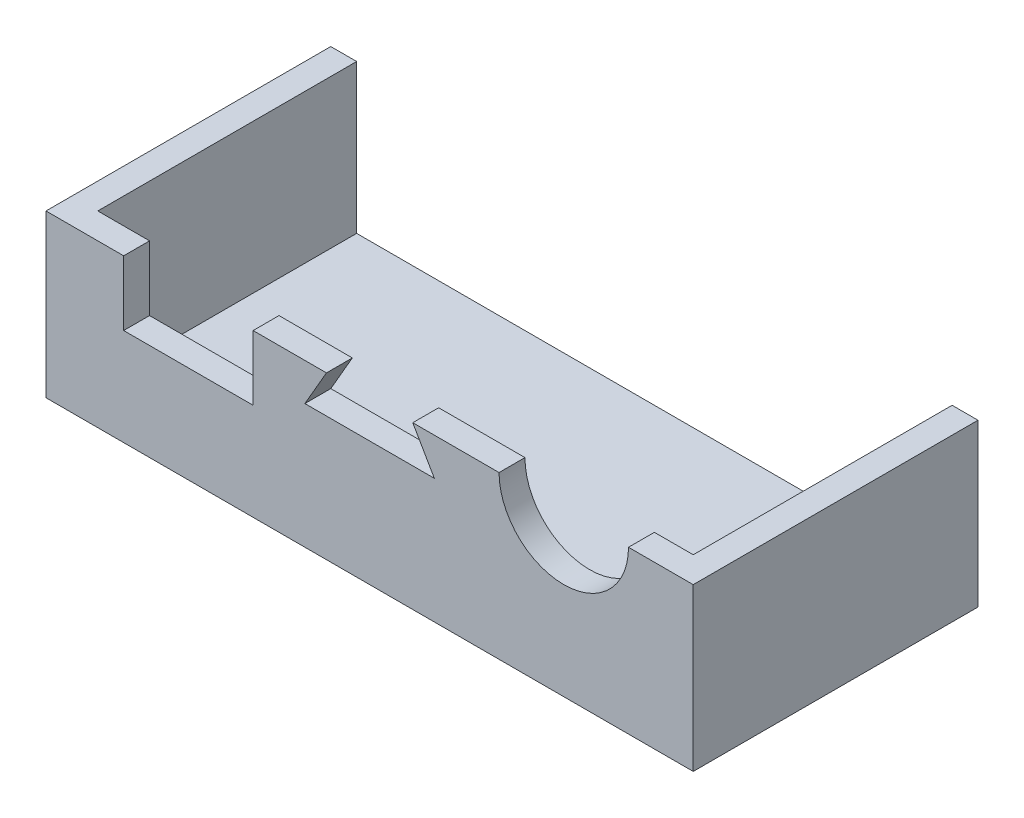
ISO-10303-21;
HEADER;
FILE_DESCRIPTION(('STEP AP214'),'2;1');
FILE_NAME('part.step','',(''),(''),'','','');
FILE_SCHEMA(('AUTOMOTIVE_DESIGN { 1 0 10303 214 1 1 1 1 }'));
ENDSEC;
DATA;
#1=APPLICATION_CONTEXT('core data for automotive mechanical design processes');
#2=APPLICATION_PROTOCOL_DEFINITION('international standard','automotive_design',2000,#1);
#3=PRODUCT_CONTEXT('',#1,'mechanical');
#4=PRODUCT('Part','Part','',(#3));
#5=PRODUCT_RELATED_PRODUCT_CATEGORY('part','',(#4));
#6=PRODUCT_DEFINITION_FORMATION('','',#4);
#7=PRODUCT_DEFINITION_CONTEXT('part definition',#1,'design');
#8=PRODUCT_DEFINITION('design','',#6,#7);
#9=PRODUCT_DEFINITION_SHAPE('','',#8);
#10=(LENGTH_UNIT() NAMED_UNIT(*) SI_UNIT(.MILLI.,.METRE.));
#11=(NAMED_UNIT(*) PLANE_ANGLE_UNIT() SI_UNIT($,.RADIAN.));
#12=(NAMED_UNIT(*) SI_UNIT($,.STERADIAN.) SOLID_ANGLE_UNIT());
#13=UNCERTAINTY_MEASURE_WITH_UNIT(LENGTH_MEASURE(1.E-05),#10,'distance_accuracy_value','');
#14=(GEOMETRIC_REPRESENTATION_CONTEXT(3) GLOBAL_UNCERTAINTY_ASSIGNED_CONTEXT((#13)) GLOBAL_UNIT_ASSIGNED_CONTEXT((#10,
#11,#12)) REPRESENTATION_CONTEXT('',''));
#15=CARTESIAN_POINT('',(0.,0.,0.));
#16=DIRECTION('',(0.,0.,1.));
#17=DIRECTION('',(1.,0.,0.));
#18=AXIS2_PLACEMENT_3D('',#15,#16,#17);
#19=CARTESIAN_POINT('',(-138.233831443166,0.,375.46845739689));
#20=DIRECTION('',(0.,1.,0.));
#21=DIRECTION('',(0.,0.,1.));
#22=AXIS2_PLACEMENT_3D('',#19,#20,#21);
#23=PLANE('',#22);
#24=DIRECTION('',(-1.,0.,0.));
#25=VECTOR('',#24,1.);
#26=CARTESIAN_POINT('',(0.,0.,110.));
#27=LINE('',#26,#25);
#28=CARTESIAN_POINT('',(125.,0.,110.));
#29=VERTEX_POINT('',#28);
#30=CARTESIAN_POINT('',(99.9999999999999,0.,110.));
#31=VERTEX_POINT('',#30);
#32=EDGE_CURVE('E320',#29,#31,#27,.T.);
#33=ORIENTED_EDGE('',*,*,#32,.F.);
#34=DIRECTION('',(0.,0.,-1.));
#35=VECTOR('',#34,1.);
#36=CARTESIAN_POINT('',(125.,0.,100.));
#37=LINE('',#36,#35);
#38=CARTESIAN_POINT('',(125.,0.,0.));
#39=VERTEX_POINT('',#38);
#40=EDGE_CURVE('E283',#29,#39,#37,.T.);
#41=ORIENTED_EDGE('',*,*,#40,.T.);
#42=DIRECTION('',(-1.,0.,0.));
#43=VECTOR('',#42,1.);
#44=CARTESIAN_POINT('',(0.,0.,0.));
#45=LINE('',#44,#43);
#46=CARTESIAN_POINT('',(115.,0.,0.));
#47=VERTEX_POINT('',#46);
#48=EDGE_CURVE('E67',#39,#47,#45,.T.);
#49=ORIENTED_EDGE('',*,*,#48,.T.);
#50=DIRECTION('',(0.,0.,-1.));
#51=VECTOR('',#50,1.);
#52=CARTESIAN_POINT('',(115.,0.,100.));
#53=LINE('',#52,#51);
#54=CARTESIAN_POINT('',(115.,0.,100.));
#55=VERTEX_POINT('',#54);
#56=EDGE_CURVE('E321',#55,#47,#53,.T.);
#57=ORIENTED_EDGE('',*,*,#56,.F.);
#58=DIRECTION('',(-1.,0.,0.));
#59=VECTOR('',#58,1.);
#60=CARTESIAN_POINT('',(0.,0.,100.));
#61=LINE('',#60,#59);
#62=CARTESIAN_POINT('',(99.9999999999999,0.,100.));
#63=VERTEX_POINT('',#62);
#64=EDGE_CURVE('E11',#55,#63,#61,.T.);
#65=ORIENTED_EDGE('',*,*,#64,.T.);
#66=DIRECTION('',(0.,0.,-1.));
#67=VECTOR('',#66,1.);
#68=CARTESIAN_POINT('',(99.9999999999999,0.,110.));
#69=LINE('',#68,#67);
#70=EDGE_CURVE('E324',#31,#63,#69,.T.);
#71=ORIENTED_EDGE('',*,*,#70,.F.);
#72=EDGE_LOOP('',(#33,#41,#49,#57,#65,#71));
#73=FACE_BOUND('',#72,.T.);
#74=ADVANCED_FACE('F42',(#73),#23,.T.);
#75=CARTESIAN_POINT('',(0.,0.,0.));
#76=DIRECTION('',(0.,0.,1.));
#77=DIRECTION('',(1.,0.,0.));
#78=AXIS2_PLACEMENT_3D('',#75,#76,#77);
#79=PLANE('',#78);
#80=ORIENTED_EDGE('',*,*,#48,.F.);
#81=DIRECTION('',(0.,1.,0.));
#82=VECTOR('',#81,1.);
#83=CARTESIAN_POINT('',(125.,-62.5,0.));
#84=LINE('',#83,#82);
#85=CARTESIAN_POINT('',(125.,-62.5,0.));
#86=VERTEX_POINT('',#85);
#87=EDGE_CURVE('E211',#86,#39,#84,.T.);
#88=ORIENTED_EDGE('',*,*,#87,.F.);
#89=DIRECTION('',(1.,0.,0.));
#90=VECTOR('',#89,1.);
#91=CARTESIAN_POINT('',(125.,-62.5,0.));
#92=LINE('',#91,#90);
#93=CARTESIAN_POINT('',(-125.,-62.5,0.));
#94=VERTEX_POINT('',#93);
#95=EDGE_CURVE('E216',#94,#86,#92,.T.);
#96=ORIENTED_EDGE('',*,*,#95,.F.);
#97=DIRECTION('',(0.,-1.,0.));
#98=VECTOR('',#97,1.);
#99=CARTESIAN_POINT('',(-125.,-62.5,0.));
#100=LINE('',#99,#98);
#101=CARTESIAN_POINT('',(-125.,0.,0.));
#102=VERTEX_POINT('',#101);
#103=EDGE_CURVE('E219',#102,#94,#100,.T.);
#104=ORIENTED_EDGE('',*,*,#103,.F.);
#105=CARTESIAN_POINT('',(-115.,0.,0.));
#106=VERTEX_POINT('',#105);
#107=EDGE_CURVE('E192',#106,#102,#45,.T.);
#108=ORIENTED_EDGE('',*,*,#107,.F.);
#109=DIRECTION('',(0.,-1.,0.));
#110=VECTOR('',#109,1.);
#111=CARTESIAN_POINT('',(-115.,-57.5,0.));
#112=LINE('',#111,#110);
#113=CARTESIAN_POINT('',(-115.,-57.5,0.));
#114=VERTEX_POINT('',#113);
#115=EDGE_CURVE('E188',#106,#114,#112,.T.);
#116=ORIENTED_EDGE('',*,*,#115,.T.);
#117=DIRECTION('',(1.,0.,0.));
#118=VECTOR('',#117,1.);
#119=CARTESIAN_POINT('',(115.,-57.5,0.));
#120=LINE('',#119,#118);
#121=CARTESIAN_POINT('',(115.,-57.5,0.));
#122=VERTEX_POINT('',#121);
#123=EDGE_CURVE('E231',#114,#122,#120,.T.);
#124=ORIENTED_EDGE('',*,*,#123,.T.);
#125=DIRECTION('',(0.,1.,0.));
#126=VECTOR('',#125,1.);
#127=CARTESIAN_POINT('',(115.,-57.5,0.));
#128=LINE('',#127,#126);
#129=EDGE_CURVE('E182',#122,#47,#128,.T.);
#130=ORIENTED_EDGE('',*,*,#129,.T.);
#131=EDGE_LOOP('',(#80,#88,#96,#104,#108,#116,#124,#130));
#132=FACE_BOUND('',#131,.T.);
#133=ADVANCED_FACE('F360',(#132),#79,.F.);
#134=CARTESIAN_POINT('',(-125.,-62.5,100.));
#135=DIRECTION('',(1.,0.,0.));
#136=DIRECTION('',(0.,0.,-1.));
#137=AXIS2_PLACEMENT_3D('',#134,#135,#136);
#138=PLANE('',#137);
#139=DIRECTION('',(0.,0.,1.));
#140=VECTOR('',#139,1.);
#141=CARTESIAN_POINT('',(-125.,0.,100.));
#142=LINE('',#141,#140);
#143=CARTESIAN_POINT('',(-125.,0.,110.));
#144=VERTEX_POINT('',#143);
#145=EDGE_CURVE('E59',#102,#144,#142,.T.);
#146=ORIENTED_EDGE('',*,*,#145,.F.);
#147=ORIENTED_EDGE('',*,*,#103,.T.);
#148=DIRECTION('',(0.,0.,-1.));
#149=VECTOR('',#148,1.);
#150=CARTESIAN_POINT('',(-125.,-62.5,100.));
#151=LINE('',#150,#149);
#152=CARTESIAN_POINT('',(-125.,-62.5,110.));
#153=VERTEX_POINT('',#152);
#154=EDGE_CURVE('E200',#153,#94,#151,.T.);
#155=ORIENTED_EDGE('',*,*,#154,.F.);
#156=DIRECTION('',(0.,-1.,0.));
#157=VECTOR('',#156,1.);
#158=CARTESIAN_POINT('',(-125.,0.,110.));
#159=LINE('',#158,#157);
#160=EDGE_CURVE('E291',#144,#153,#159,.T.);
#161=ORIENTED_EDGE('',*,*,#160,.F.);
#162=EDGE_LOOP('',(#146,#147,#155,#161));
#163=FACE_BOUND('',#162,.T.);
#164=ADVANCED_FACE('F44',(#163),#138,.F.);
#165=CARTESIAN_POINT('',(125.,-62.5,100.));
#166=DIRECTION('',(-1.,0.,0.));
#167=DIRECTION('',(0.,0.,1.));
#168=AXIS2_PLACEMENT_3D('',#165,#166,#167);
#169=PLANE('',#168);
#170=ORIENTED_EDGE('',*,*,#40,.F.);
#171=DIRECTION('',(0.,1.,0.));
#172=VECTOR('',#171,1.);
#173=CARTESIAN_POINT('',(125.,0.,110.));
#174=LINE('',#173,#172);
#175=CARTESIAN_POINT('',(125.,-62.5,110.));
#176=VERTEX_POINT('',#175);
#177=EDGE_CURVE('E252',#176,#29,#174,.T.);
#178=ORIENTED_EDGE('',*,*,#177,.F.);
#179=DIRECTION('',(0.,0.,-1.));
#180=VECTOR('',#179,1.);
#181=CARTESIAN_POINT('',(125.,-62.5,100.));
#182=LINE('',#181,#180);
#183=EDGE_CURVE('E205',#176,#86,#182,.T.);
#184=ORIENTED_EDGE('',*,*,#183,.T.);
#185=ORIENTED_EDGE('',*,*,#87,.T.);
#186=EDGE_LOOP('',(#170,#178,#184,#185));
#187=FACE_BOUND('',#186,.T.);
#188=ADVANCED_FACE('F367',(#187),#169,.F.);
#189=CARTESIAN_POINT('',(-115.,-57.5,100.));
#190=DIRECTION('',(1.,0.,0.));
#191=DIRECTION('',(0.,0.,-1.));
#192=AXIS2_PLACEMENT_3D('',#189,#190,#191);
#193=PLANE('',#192);
#194=ORIENTED_EDGE('',*,*,#115,.F.);
#195=DIRECTION('',(0.,0.,1.));
#196=VECTOR('',#195,1.);
#197=CARTESIAN_POINT('',(-115.,0.,100.));
#198=LINE('',#197,#196);
#199=CARTESIAN_POINT('',(-115.,0.,100.));
#200=VERTEX_POINT('',#199);
#201=EDGE_CURVE('E186',#106,#200,#198,.T.);
#202=ORIENTED_EDGE('',*,*,#201,.T.);
#203=DIRECTION('',(0.,-1.,0.));
#204=VECTOR('',#203,1.);
#205=CARTESIAN_POINT('',(-115.,-57.5,100.));
#206=LINE('',#205,#204);
#207=CARTESIAN_POINT('',(-115.,-57.5,100.));
#208=VERTEX_POINT('',#207);
#209=EDGE_CURVE('E171',#200,#208,#206,.T.);
#210=ORIENTED_EDGE('',*,*,#209,.T.);
#211=DIRECTION('',(0.,0.,-1.));
#212=VECTOR('',#211,1.);
#213=CARTESIAN_POINT('',(-115.,-57.5,100.));
#214=LINE('',#213,#212);
#215=EDGE_CURVE('E222',#208,#114,#214,.T.);
#216=ORIENTED_EDGE('',*,*,#215,.T.);
#217=EDGE_LOOP('',(#194,#202,#210,#216));
#218=FACE_BOUND('',#217,.T.);
#219=ADVANCED_FACE('F187',(#218),#193,.T.);
#220=CARTESIAN_POINT('',(115.,-57.5,100.));
#221=DIRECTION('',(-1.,0.,0.));
#222=DIRECTION('',(0.,0.,1.));
#223=AXIS2_PLACEMENT_3D('',#220,#221,#222);
#224=PLANE('',#223);
#225=DIRECTION('',(0.,1.,0.));
#226=VECTOR('',#225,1.);
#227=CARTESIAN_POINT('',(115.,-57.5,100.));
#228=LINE('',#227,#226);
#229=CARTESIAN_POINT('',(115.,-57.5,100.));
#230=VERTEX_POINT('',#229);
#231=EDGE_CURVE('E228',#230,#55,#228,.T.);
#232=ORIENTED_EDGE('',*,*,#231,.T.);
#233=ORIENTED_EDGE('',*,*,#56,.T.);
#234=ORIENTED_EDGE('',*,*,#129,.F.);
#235=DIRECTION('',(0.,0.,-1.));
#236=VECTOR('',#235,1.);
#237=CARTESIAN_POINT('',(115.,-57.5,100.));
#238=LINE('',#237,#236);
#239=EDGE_CURVE('E225',#230,#122,#238,.T.);
#240=ORIENTED_EDGE('',*,*,#239,.F.);
#241=EDGE_LOOP('',(#232,#233,#234,#240));
#242=FACE_BOUND('',#241,.T.);
#243=ADVANCED_FACE('F409',(#242),#224,.T.);
#244=CARTESIAN_POINT('',(12.5,7.21687836487032,110.));
#245=DIRECTION('',(0.866025403784439,0.5,0.));
#246=DIRECTION('',(-0.5,0.866025403784439,0.));
#247=AXIS2_PLACEMENT_3D('',#244,#245,#246);
#248=PLANE('',#247);
#249=DIRECTION('',(0.,0.,1.));
#250=VECTOR('',#249,1.);
#251=CARTESIAN_POINT('',(16.6666666666667,0.,110.));
#252=LINE('',#251,#250);
#253=CARTESIAN_POINT('',(16.6666666666667,0.,100.));
#254=VERTEX_POINT('',#253);
#255=CARTESIAN_POINT('',(16.6666666666667,0.,110.));
#256=VERTEX_POINT('',#255);
#257=EDGE_CURVE('E329',#254,#256,#252,.T.);
#258=ORIENTED_EDGE('',*,*,#257,.F.);
#259=DIRECTION('',(0.5,-0.866025403784439,0.));
#260=VECTOR('',#259,1.);
#261=CARTESIAN_POINT('',(12.5,7.21687836487032,100.));
#262=LINE('',#261,#260);
#263=CARTESIAN_POINT('',(25.,-14.4337567297406,100.));
#264=VERTEX_POINT('',#263);
#265=EDGE_CURVE('E267',#254,#264,#262,.T.);
#266=ORIENTED_EDGE('',*,*,#265,.T.);
#267=DIRECTION('',(0.,0.,-1.));
#268=VECTOR('',#267,1.);
#269=CARTESIAN_POINT('',(25.,-14.4337567297406,110.));
#270=LINE('',#269,#268);
#271=CARTESIAN_POINT('',(25.,-14.4337567297406,110.));
#272=VERTEX_POINT('',#271);
#273=EDGE_CURVE('E237',#272,#264,#270,.T.);
#274=ORIENTED_EDGE('',*,*,#273,.F.);
#275=DIRECTION('',(0.5,-0.866025403784439,0.));
#276=VECTOR('',#275,1.);
#277=CARTESIAN_POINT('',(12.5,7.21687836487032,110.));
#278=LINE('',#277,#276);
#279=EDGE_CURVE('E301',#256,#272,#278,.T.);
#280=ORIENTED_EDGE('',*,*,#279,.F.);
#281=EDGE_LOOP('',(#258,#266,#274,#280));
#282=FACE_BOUND('',#281,.T.);
#283=ADVANCED_FACE('F400',(#282),#248,.F.);
#284=CARTESIAN_POINT('',(-45.,0.,110.));
#285=DIRECTION('',(1.,0.,0.));
#286=DIRECTION('',(0.,1.,0.));
#287=AXIS2_PLACEMENT_3D('',#284,#285,#286);
#288=PLANE('',#287);
#289=DIRECTION('',(0.,0.,1.));
#290=VECTOR('',#289,1.);
#291=CARTESIAN_POINT('',(-45.,0.,110.));
#292=LINE('',#291,#290);
#293=CARTESIAN_POINT('',(-45.,0.,100.));
#294=VERTEX_POINT('',#293);
#295=CARTESIAN_POINT('',(-45.,0.,110.));
#296=VERTEX_POINT('',#295);
#297=EDGE_CURVE('E337',#294,#296,#292,.T.);
#298=ORIENTED_EDGE('',*,*,#297,.F.);
#299=DIRECTION('',(0.,-1.,0.));
#300=VECTOR('',#299,1.);
#301=CARTESIAN_POINT('',(-45.,0.,100.));
#302=LINE('',#301,#300);
#303=CARTESIAN_POINT('',(-45.,-25.,100.));
#304=VERTEX_POINT('',#303);
#305=EDGE_CURVE('E277',#294,#304,#302,.T.);
#306=ORIENTED_EDGE('',*,*,#305,.T.);
#307=DIRECTION('',(0.,0.,-1.));
#308=VECTOR('',#307,1.);
#309=CARTESIAN_POINT('',(-45.,-25.,110.));
#310=LINE('',#309,#308);
#311=CARTESIAN_POINT('',(-45.,-25.,110.));
#312=VERTEX_POINT('',#311);
#313=EDGE_CURVE('E243',#312,#304,#310,.T.);
#314=ORIENTED_EDGE('',*,*,#313,.F.);
#315=DIRECTION('',(0.,-1.,0.));
#316=VECTOR('',#315,1.);
#317=CARTESIAN_POINT('',(-45.,0.,110.));
#318=LINE('',#317,#316);
#319=EDGE_CURVE('E311',#296,#312,#318,.T.);
#320=ORIENTED_EDGE('',*,*,#319,.F.);
#321=EDGE_LOOP('',(#298,#306,#314,#320));
#322=FACE_BOUND('',#321,.T.);
#323=ADVANCED_FACE('F385',(#322),#288,.F.);
#324=CARTESIAN_POINT('',(-12.5,7.21687836487033,110.));
#325=DIRECTION('',(-0.866025403784439,0.5,0.));
#326=DIRECTION('',(-0.5,-0.866025403784439,0.));
#327=AXIS2_PLACEMENT_3D('',#324,#325,#326);
#328=PLANE('',#327);
#329=DIRECTION('',(0.,0.,-1.));
#330=VECTOR('',#329,1.);
#331=CARTESIAN_POINT('',(-16.6666666666667,0.,110.));
#332=LINE('',#331,#330);
#333=CARTESIAN_POINT('',(-16.6666666666667,0.,110.));
#334=VERTEX_POINT('',#333);
#335=CARTESIAN_POINT('',(-16.6666666666667,0.,100.));
#336=VERTEX_POINT('',#335);
#337=EDGE_CURVE('E341',#334,#336,#332,.T.);
#338=ORIENTED_EDGE('',*,*,#337,.F.);
#339=DIRECTION('',(0.5,0.866025403784439,0.));
#340=VECTOR('',#339,1.);
#341=CARTESIAN_POINT('',(-12.5,7.21687836487033,110.));
#342=LINE('',#341,#340);
#343=CARTESIAN_POINT('',(-25.,-14.4337567297406,110.));
#344=VERTEX_POINT('',#343);
#345=EDGE_CURVE('E294',#344,#334,#342,.T.);
#346=ORIENTED_EDGE('',*,*,#345,.F.);
#347=DIRECTION('',(0.,0.,-1.));
#348=VECTOR('',#347,1.);
#349=CARTESIAN_POINT('',(-25.,-14.4337567297406,110.));
#350=LINE('',#349,#348);
#351=CARTESIAN_POINT('',(-25.,-14.4337567297406,100.));
#352=VERTEX_POINT('',#351);
#353=EDGE_CURVE('E247',#344,#352,#350,.T.);
#354=ORIENTED_EDGE('',*,*,#353,.T.);
#355=DIRECTION('',(0.5,0.866025403784439,0.));
#356=VECTOR('',#355,1.);
#357=CARTESIAN_POINT('',(-12.5,7.21687836487033,100.));
#358=LINE('',#357,#356);
#359=EDGE_CURVE('E259',#352,#336,#358,.T.);
#360=ORIENTED_EDGE('',*,*,#359,.T.);
#361=EDGE_LOOP('',(#338,#346,#354,#360));
#362=FACE_BOUND('',#361,.T.);
#363=ADVANCED_FACE('F390',(#362),#328,.F.);
#364=CARTESIAN_POINT('',(-95.,0.,110.));
#365=DIRECTION('',(1.,0.,0.));
#366=DIRECTION('',(0.,0.,-1.));
#367=AXIS2_PLACEMENT_3D('',#364,#365,#366);
#368=PLANE('',#367);
#369=DIRECTION('',(0.,-1.,0.));
#370=VECTOR('',#369,1.);
#371=CARTESIAN_POINT('',(-95.,0.,100.));
#372=LINE('',#371,#370);
#373=CARTESIAN_POINT('',(-95.,0.,100.));
#374=VERTEX_POINT('',#373);
#375=CARTESIAN_POINT('',(-95.,-25.,100.));
#376=VERTEX_POINT('',#375);
#377=EDGE_CURVE('E270',#374,#376,#372,.T.);
#378=ORIENTED_EDGE('',*,*,#377,.F.);
#379=DIRECTION('',(0.,0.,1.));
#380=VECTOR('',#379,1.);
#381=CARTESIAN_POINT('',(-95.,0.,110.));
#382=LINE('',#381,#380);
#383=CARTESIAN_POINT('',(-95.,0.,110.));
#384=VERTEX_POINT('',#383);
#385=EDGE_CURVE('E193',#374,#384,#382,.T.);
#386=ORIENTED_EDGE('',*,*,#385,.T.);
#387=DIRECTION('',(0.,-1.,0.));
#388=VECTOR('',#387,1.);
#389=CARTESIAN_POINT('',(-95.,0.,110.));
#390=LINE('',#389,#388);
#391=CARTESIAN_POINT('',(-95.,-25.,110.));
#392=VERTEX_POINT('',#391);
#393=EDGE_CURVE('E304',#384,#392,#390,.T.);
#394=ORIENTED_EDGE('',*,*,#393,.T.);
#395=DIRECTION('',(0.,0.,-1.));
#396=VECTOR('',#395,1.);
#397=CARTESIAN_POINT('',(-95.,-25.,110.));
#398=LINE('',#397,#396);
#399=EDGE_CURVE('E248',#392,#376,#398,.T.);
#400=ORIENTED_EDGE('',*,*,#399,.T.);
#401=EDGE_LOOP('',(#378,#386,#394,#400));
#402=FACE_BOUND('',#401,.T.);
#403=ADVANCED_FACE('F355',(#402),#368,.T.);
#404=CARTESIAN_POINT('',(74.9999999999999,0.,110.));
#405=DIRECTION('',(0.,0.,-1.));
#406=DIRECTION('',(-1.,0.,0.));
#407=AXIS2_PLACEMENT_3D('',#404,#405,#406);
#408=CYLINDRICAL_SURFACE('',#407,25.);
#409=CARTESIAN_POINT('',(74.9999999999999,0.,110.));
#410=DIRECTION('',(0.,0.,1.));
#411=DIRECTION('',(1.,0.,0.));
#412=AXIS2_PLACEMENT_3D('',#409,#410,#411);
#413=CIRCLE('',#412,25.);
#414=CARTESIAN_POINT('',(49.9999999999999,0.,110.));
#415=VERTEX_POINT('',#414);
#416=EDGE_CURVE('E263',#415,#31,#413,.T.);
#417=ORIENTED_EDGE('',*,*,#416,.T.);
#418=ORIENTED_EDGE('',*,*,#70,.T.);
#419=CARTESIAN_POINT('',(74.9999999999999,0.,100.));
#420=DIRECTION('',(0.,0.,1.));
#421=DIRECTION('',(1.,0.,0.));
#422=AXIS2_PLACEMENT_3D('',#419,#420,#421);
#423=CIRCLE('',#422,25.);
#424=CARTESIAN_POINT('',(49.9999999999999,0.,100.));
#425=VERTEX_POINT('',#424);
#426=EDGE_CURVE('E280',#425,#63,#423,.T.);
#427=ORIENTED_EDGE('',*,*,#426,.F.);
#428=DIRECTION('',(0.,0.,-1.));
#429=VECTOR('',#428,1.);
#430=CARTESIAN_POINT('',(49.9999999999999,0.,110.));
#431=LINE('',#430,#429);
#432=EDGE_CURVE('E333',#425,#415,#431,.F.);
#433=ORIENTED_EDGE('',*,*,#432,.T.);
#434=EDGE_LOOP('',(#417,#418,#427,#433));
#435=FACE_BOUND('',#434,.T.);
#436=ADVANCED_FACE('F406',(#435),#408,.F.);
#437=CARTESIAN_POINT('',(0.,0.,110.));
#438=DIRECTION('',(0.,0.,1.));
#439=DIRECTION('',(1.,0.,0.));
#440=AXIS2_PLACEMENT_3D('',#437,#438,#439);
#441=PLANE('',#440);
#442=ORIENTED_EDGE('',*,*,#177,.T.);
#443=ORIENTED_EDGE('',*,*,#32,.T.);
#444=ORIENTED_EDGE('',*,*,#416,.F.);
#445=EDGE_CURVE('E328',#415,#256,#27,.T.);
#446=ORIENTED_EDGE('',*,*,#445,.T.);
#447=ORIENTED_EDGE('',*,*,#279,.T.);
#448=DIRECTION('',(-1.,0.,0.));
#449=VECTOR('',#448,1.);
#450=CARTESIAN_POINT('',(0.,-14.4337567297406,110.));
#451=LINE('',#450,#449);
#452=EDGE_CURVE('E298',#272,#344,#451,.T.);
#453=ORIENTED_EDGE('',*,*,#452,.T.);
#454=ORIENTED_EDGE('',*,*,#345,.T.);
#455=EDGE_CURVE('E336',#334,#296,#27,.T.);
#456=ORIENTED_EDGE('',*,*,#455,.T.);
#457=ORIENTED_EDGE('',*,*,#319,.T.);
#458=DIRECTION('',(1.,0.,0.));
#459=VECTOR('',#458,1.);
#460=CARTESIAN_POINT('',(0.,-25.,110.));
#461=LINE('',#460,#459);
#462=EDGE_CURVE('E307',#392,#312,#461,.T.);
#463=ORIENTED_EDGE('',*,*,#462,.F.);
#464=ORIENTED_EDGE('',*,*,#393,.F.);
#465=EDGE_CURVE('E347',#384,#144,#27,.T.);
#466=ORIENTED_EDGE('',*,*,#465,.T.);
#467=ORIENTED_EDGE('',*,*,#160,.T.);
#468=DIRECTION('',(1.,0.,0.));
#469=VECTOR('',#468,1.);
#470=CARTESIAN_POINT('',(0.,-62.5,110.));
#471=LINE('',#470,#469);
#472=EDGE_CURVE('E287',#153,#176,#471,.T.);
#473=ORIENTED_EDGE('',*,*,#472,.T.);
#474=EDGE_LOOP('',(#442,#443,#444,#446,#447,#453,#454,#456,#457,#463,#464,#466,#467,#473));
#475=FACE_BOUND('',#474,.T.);
#476=ADVANCED_FACE('F359',(#475),#441,.T.);
#477=CARTESIAN_POINT('',(0.,0.,100.));
#478=DIRECTION('',(0.,0.,1.));
#479=DIRECTION('',(1.,0.,0.));
#480=AXIS2_PLACEMENT_3D('',#477,#478,#479);
#481=PLANE('',#480);
#482=ORIENTED_EDGE('',*,*,#64,.F.);
#483=ORIENTED_EDGE('',*,*,#231,.F.);
#484=DIRECTION('',(1.,0.,0.));
#485=VECTOR('',#484,1.);
#486=CARTESIAN_POINT('',(115.,-57.5,100.));
#487=LINE('',#486,#485);
#488=EDGE_CURVE('E177',#208,#230,#487,.T.);
#489=ORIENTED_EDGE('',*,*,#488,.F.);
#490=ORIENTED_EDGE('',*,*,#209,.F.);
#491=EDGE_CURVE('E46',#374,#200,#61,.T.);
#492=ORIENTED_EDGE('',*,*,#491,.F.);
#493=ORIENTED_EDGE('',*,*,#377,.T.);
#494=DIRECTION('',(1.,0.,0.));
#495=VECTOR('',#494,1.);
#496=CARTESIAN_POINT('',(0.,-25.,100.));
#497=LINE('',#496,#495);
#498=EDGE_CURVE('E273',#376,#304,#497,.T.);
#499=ORIENTED_EDGE('',*,*,#498,.T.);
#500=ORIENTED_EDGE('',*,*,#305,.F.);
#501=EDGE_CURVE('E199',#336,#294,#61,.T.);
#502=ORIENTED_EDGE('',*,*,#501,.F.);
#503=ORIENTED_EDGE('',*,*,#359,.F.);
#504=DIRECTION('',(-1.,0.,0.));
#505=VECTOR('',#504,1.);
#506=CARTESIAN_POINT('',(0.,-14.4337567297406,100.));
#507=LINE('',#506,#505);
#508=EDGE_CURVE('E264',#264,#352,#507,.T.);
#509=ORIENTED_EDGE('',*,*,#508,.F.);
#510=ORIENTED_EDGE('',*,*,#265,.F.);
#511=EDGE_CURVE('E52',#425,#254,#61,.T.);
#512=ORIENTED_EDGE('',*,*,#511,.F.);
#513=ORIENTED_EDGE('',*,*,#426,.T.);
#514=EDGE_LOOP('',(#482,#483,#489,#490,#492,#493,#499,#500,#502,#503,#509,#510,#512,#513));
#515=FACE_BOUND('',#514,.T.);
#516=ADVANCED_FACE('F173',(#515),#481,.F.);
#517=CARTESIAN_POINT('',(125.,-62.5,100.));
#518=DIRECTION('',(0.,1.,0.));
#519=DIRECTION('',(-1.,0.,0.));
#520=AXIS2_PLACEMENT_3D('',#517,#518,#519);
#521=PLANE('',#520);
#522=ORIENTED_EDGE('',*,*,#95,.T.);
#523=ORIENTED_EDGE('',*,*,#183,.F.);
#524=ORIENTED_EDGE('',*,*,#472,.F.);
#525=ORIENTED_EDGE('',*,*,#154,.T.);
#526=EDGE_LOOP('',(#522,#523,#524,#525));
#527=FACE_BOUND('',#526,.T.);
#528=ADVANCED_FACE('F363',(#527),#521,.F.);
#529=CARTESIAN_POINT('',(115.,-57.5,100.));
#530=DIRECTION('',(0.,1.,0.));
#531=DIRECTION('',(0.,0.,1.));
#532=AXIS2_PLACEMENT_3D('',#529,#530,#531);
#533=PLANE('',#532);
#534=ORIENTED_EDGE('',*,*,#123,.F.);
#535=ORIENTED_EDGE('',*,*,#215,.F.);
#536=ORIENTED_EDGE('',*,*,#488,.T.);
#537=ORIENTED_EDGE('',*,*,#239,.T.);
#538=EDGE_LOOP('',(#534,#535,#536,#537));
#539=FACE_BOUND('',#538,.T.);
#540=ADVANCED_FACE('F412',(#539),#533,.T.);
#541=CARTESIAN_POINT('',(0.,-14.4337567297406,110.));
#542=DIRECTION('',(0.,-1.,0.));
#543=DIRECTION('',(1.,0.,0.));
#544=AXIS2_PLACEMENT_3D('',#541,#542,#543);
#545=PLANE('',#544);
#546=ORIENTED_EDGE('',*,*,#508,.T.);
#547=ORIENTED_EDGE('',*,*,#353,.F.);
#548=ORIENTED_EDGE('',*,*,#452,.F.);
#549=ORIENTED_EDGE('',*,*,#273,.T.);
#550=EDGE_LOOP('',(#546,#547,#548,#549));
#551=FACE_BOUND('',#550,.T.);
#552=ADVANCED_FACE('F394',(#551),#545,.F.);
#553=CARTESIAN_POINT('',(0.,-25.,110.));
#554=DIRECTION('',(0.,1.,0.));
#555=DIRECTION('',(0.,0.,1.));
#556=AXIS2_PLACEMENT_3D('',#553,#554,#555);
#557=PLANE('',#556);
#558=ORIENTED_EDGE('',*,*,#498,.F.);
#559=ORIENTED_EDGE('',*,*,#399,.F.);
#560=ORIENTED_EDGE('',*,*,#462,.T.);
#561=ORIENTED_EDGE('',*,*,#313,.T.);
#562=EDGE_LOOP('',(#558,#559,#560,#561));
#563=FACE_BOUND('',#562,.T.);
#564=ADVANCED_FACE('F419',(#563),#557,.T.);
#565=ORIENTED_EDGE('',*,*,#455,.F.);
#566=ORIENTED_EDGE('',*,*,#337,.T.);
#567=ORIENTED_EDGE('',*,*,#501,.T.);
#568=ORIENTED_EDGE('',*,*,#297,.T.);
#569=EDGE_LOOP('',(#565,#566,#567,#568));
#570=FACE_BOUND('',#569,.T.);
#571=ADVANCED_FACE('F386',(#570),#23,.T.);
#572=ORIENTED_EDGE('',*,*,#445,.F.);
#573=ORIENTED_EDGE('',*,*,#432,.F.);
#574=ORIENTED_EDGE('',*,*,#511,.T.);
#575=ORIENTED_EDGE('',*,*,#257,.T.);
#576=EDGE_LOOP('',(#572,#573,#574,#575));
#577=FACE_BOUND('',#576,.T.);
#578=ADVANCED_FACE('F403',(#577),#23,.T.);
#579=ORIENTED_EDGE('',*,*,#107,.T.);
#580=ORIENTED_EDGE('',*,*,#145,.T.);
#581=ORIENTED_EDGE('',*,*,#465,.F.);
#582=ORIENTED_EDGE('',*,*,#385,.F.);
#583=ORIENTED_EDGE('',*,*,#491,.T.);
#584=ORIENTED_EDGE('',*,*,#201,.F.);
#585=EDGE_LOOP('',(#579,#580,#581,#582,#583,#584));
#586=FACE_BOUND('',#585,.T.);
#587=ADVANCED_FACE('F196',(#586),#23,.T.);
#588=CLOSED_SHELL('',(#74,#133,#164,#188,#219,#243,#283,#323,#363,#403,#436,#476,#516,#528,#540,
#552,#564,#571,#578,#587));
#589=MANIFOLD_SOLID_BREP('B2',#588);
#590=ADVANCED_BREP_SHAPE_REPRESENTATION('',(#18,#589),#14);
#591=SHAPE_DEFINITION_REPRESENTATION(#9,#590);
ENDSEC;
END-ISO-10303-21;
